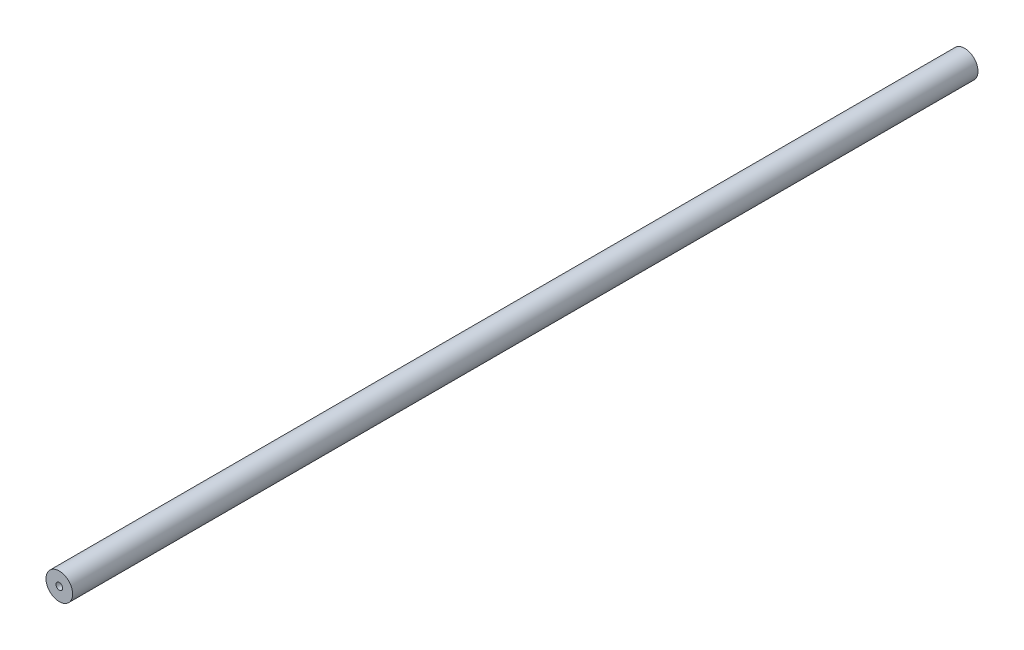
ISO-10303-21;
HEADER;
FILE_DESCRIPTION(('STEP AP214'),'2;1');
FILE_NAME('part.step','',(''),(''),'','','');
FILE_SCHEMA(('AUTOMOTIVE_DESIGN { 1 0 10303 214 1 1 1 1 }'));
ENDSEC;
DATA;
#1=APPLICATION_CONTEXT('core data for automotive mechanical design processes');
#2=APPLICATION_PROTOCOL_DEFINITION('international standard','automotive_design',2000,#1);
#3=PRODUCT_CONTEXT('',#1,'mechanical');
#4=PRODUCT('Part','Part','',(#3));
#5=PRODUCT_RELATED_PRODUCT_CATEGORY('part','',(#4));
#6=PRODUCT_DEFINITION_FORMATION('','',#4);
#7=PRODUCT_DEFINITION_CONTEXT('part definition',#1,'design');
#8=PRODUCT_DEFINITION('design','',#6,#7);
#9=PRODUCT_DEFINITION_SHAPE('','',#8);
#10=(LENGTH_UNIT() NAMED_UNIT(*) SI_UNIT(.MILLI.,.METRE.));
#11=(NAMED_UNIT(*) PLANE_ANGLE_UNIT() SI_UNIT($,.RADIAN.));
#12=(NAMED_UNIT(*) SI_UNIT($,.STERADIAN.) SOLID_ANGLE_UNIT());
#13=UNCERTAINTY_MEASURE_WITH_UNIT(LENGTH_MEASURE(1.E-05),#10,'distance_accuracy_value','');
#14=(GEOMETRIC_REPRESENTATION_CONTEXT(3) GLOBAL_UNCERTAINTY_ASSIGNED_CONTEXT((#13)) GLOBAL_UNIT_ASSIGNED_CONTEXT((#10,
#11,#12)) REPRESENTATION_CONTEXT('',''));
#15=CARTESIAN_POINT('',(0.,0.,0.));
#16=DIRECTION('',(0.,0.,1.));
#17=DIRECTION('',(1.,0.,0.));
#18=AXIS2_PLACEMENT_3D('',#15,#16,#17);
#19=CARTESIAN_POINT('',(0.,0.,863.6));
#20=DIRECTION('',(0.,0.,-1.));
#21=DIRECTION('',(-1.,0.,0.));
#22=AXIS2_PLACEMENT_3D('',#19,#20,#21);
#23=CYLINDRICAL_SURFACE('',#22,12.7);
#24=CARTESIAN_POINT('',(0.,0.,863.6));
#25=DIRECTION('',(0.,0.,1.));
#26=DIRECTION('',(1.,0.,0.));
#27=AXIS2_PLACEMENT_3D('',#24,#25,#26);
#28=CIRCLE('',#27,12.7);
#29=CARTESIAN_POINT('',(12.7,0.,863.6));
#30=VERTEX_POINT('',#29);
#31=EDGE_CURVE('E10',#30,#30,#28,.T.);
#32=ORIENTED_EDGE('',*,*,#31,.F.);
#33=EDGE_LOOP('',(#32));
#34=FACE_BOUND('',#33,.T.);
#35=CARTESIAN_POINT('',(0.,0.,0.));
#36=DIRECTION('',(0.,0.,1.));
#37=DIRECTION('',(1.,0.,0.));
#38=AXIS2_PLACEMENT_3D('',#35,#36,#37);
#39=CIRCLE('',#38,12.7);
#40=CARTESIAN_POINT('',(12.7,0.,0.));
#41=VERTEX_POINT('',#40);
#42=EDGE_CURVE('E40',#41,#41,#39,.T.);
#43=ORIENTED_EDGE('',*,*,#42,.T.);
#44=EDGE_LOOP('',(#43));
#45=FACE_BOUND('',#44,.T.);
#46=ADVANCED_FACE('F37',(#34,#45),#23,.T.);
#47=CARTESIAN_POINT('',(0.,0.,863.6));
#48=DIRECTION('',(0.,0.,1.));
#49=DIRECTION('',(1.,0.,0.));
#50=AXIS2_PLACEMENT_3D('',#47,#48,#49);
#51=PLANE('',#50);
#52=CARTESIAN_POINT('',(0.,0.,863.6));
#53=DIRECTION('',(0.,0.,1.));
#54=DIRECTION('',(1.,0.,0.));
#55=AXIS2_PLACEMENT_3D('',#52,#53,#54);
#56=CIRCLE('',#55,3.175);
#57=CARTESIAN_POINT('',(3.175,0.,863.6));
#58=VERTEX_POINT('',#57);
#59=EDGE_CURVE('E51',#58,#58,#56,.T.);
#60=ORIENTED_EDGE('',*,*,#59,.F.);
#61=EDGE_LOOP('',(#60));
#62=FACE_BOUND('',#61,.T.);
#63=ORIENTED_EDGE('',*,*,#31,.T.);
#64=EDGE_LOOP('',(#63));
#65=FACE_BOUND('',#64,.T.);
#66=ADVANCED_FACE('F68',(#62,#65),#51,.T.);
#67=CARTESIAN_POINT('',(0.,0.,0.));
#68=DIRECTION('',(0.,0.,1.));
#69=DIRECTION('',(1.,0.,0.));
#70=AXIS2_PLACEMENT_3D('',#67,#68,#69);
#71=PLANE('',#70);
#72=CARTESIAN_POINT('',(0.,0.,0.));
#73=DIRECTION('',(0.,0.,1.));
#74=DIRECTION('',(1.,0.,0.));
#75=AXIS2_PLACEMENT_3D('',#72,#73,#74);
#76=CIRCLE('',#75,3.175);
#77=CARTESIAN_POINT('',(3.175,0.,0.));
#78=VERTEX_POINT('',#77);
#79=EDGE_CURVE('E49',#78,#78,#76,.T.);
#80=ORIENTED_EDGE('',*,*,#79,.T.);
#81=EDGE_LOOP('',(#80));
#82=FACE_BOUND('',#81,.T.);
#83=ORIENTED_EDGE('',*,*,#42,.F.);
#84=EDGE_LOOP('',(#83));
#85=FACE_BOUND('',#84,.T.);
#86=ADVANCED_FACE('F59',(#82,#85),#71,.F.);
#87=CARTESIAN_POINT('',(0.,0.,0.));
#88=DIRECTION('',(0.,0.,1.));
#89=DIRECTION('',(1.,0.,0.));
#90=AXIS2_PLACEMENT_3D('',#87,#88,#89);
#91=CYLINDRICAL_SURFACE('',#90,3.175);
#92=ORIENTED_EDGE('',*,*,#79,.F.);
#93=EDGE_LOOP('',(#92));
#94=FACE_BOUND('',#93,.T.);
#95=ORIENTED_EDGE('',*,*,#59,.T.);
#96=EDGE_LOOP('',(#95));
#97=FACE_BOUND('',#96,.T.);
#98=ADVANCED_FACE('F62',(#94,#97),#91,.F.);
#99=CLOSED_SHELL('',(#46,#66,#86,#98));
#100=MANIFOLD_SOLID_BREP('B2',#99);
#101=ADVANCED_BREP_SHAPE_REPRESENTATION('',(#18,#100),#14);
#102=SHAPE_DEFINITION_REPRESENTATION(#9,#101);
ENDSEC;
END-ISO-10303-21;
